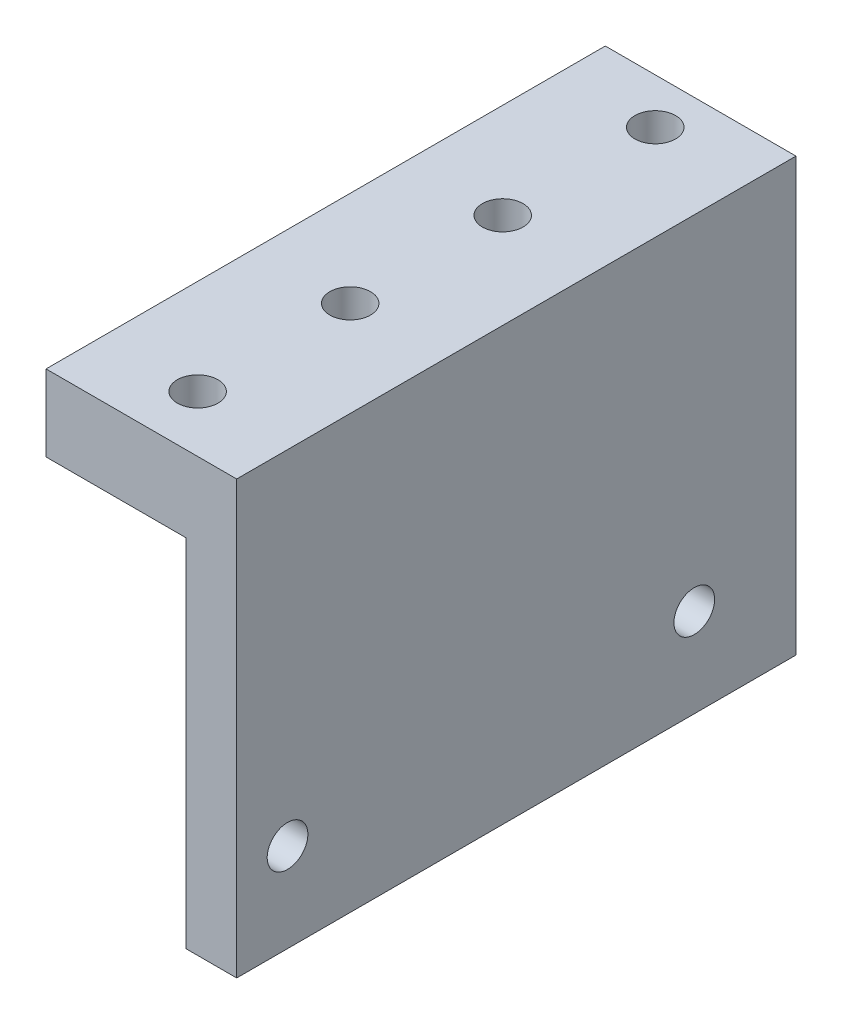
ISO-10303-21;
HEADER;
FILE_DESCRIPTION(('STEP AP214'),'2;1');
FILE_NAME('part.step','',(''),(''),'','','');
FILE_SCHEMA(('AUTOMOTIVE_DESIGN { 1 0 10303 214 1 1 1 1 }'));
ENDSEC;
DATA;
#1=APPLICATION_CONTEXT('core data for automotive mechanical design processes');
#2=APPLICATION_PROTOCOL_DEFINITION('international standard','automotive_design',2000,#1);
#3=PRODUCT_CONTEXT('',#1,'mechanical');
#4=PRODUCT('Part','Part','',(#3));
#5=PRODUCT_RELATED_PRODUCT_CATEGORY('part','',(#4));
#6=PRODUCT_DEFINITION_FORMATION('','',#4);
#7=PRODUCT_DEFINITION_CONTEXT('part definition',#1,'design');
#8=PRODUCT_DEFINITION('design','',#6,#7);
#9=PRODUCT_DEFINITION_SHAPE('','',#8);
#10=(LENGTH_UNIT() NAMED_UNIT(*) SI_UNIT(.MILLI.,.METRE.));
#11=(NAMED_UNIT(*) PLANE_ANGLE_UNIT() SI_UNIT($,.RADIAN.));
#12=(NAMED_UNIT(*) SI_UNIT($,.STERADIAN.) SOLID_ANGLE_UNIT());
#13=UNCERTAINTY_MEASURE_WITH_UNIT(LENGTH_MEASURE(1.E-05),#10,'distance_accuracy_value','');
#14=(GEOMETRIC_REPRESENTATION_CONTEXT(3) GLOBAL_UNCERTAINTY_ASSIGNED_CONTEXT((#13)) GLOBAL_UNIT_ASSIGNED_CONTEXT((#10,
#11,#12)) REPRESENTATION_CONTEXT('',''));
#15=CARTESIAN_POINT('',(0.,0.,0.));
#16=DIRECTION('',(0.,0.,1.));
#17=DIRECTION('',(1.,0.,0.));
#18=AXIS2_PLACEMENT_3D('',#15,#16,#17);
#19=CARTESIAN_POINT('',(-65.5851564185545,60.7407982740022,44.));
#20=DIRECTION('',(0.,-1.,0.));
#21=DIRECTION('',(1.,0.,0.));
#22=AXIS2_PLACEMENT_3D('',#19,#20,#21);
#23=PLANE('',#22);
#24=CARTESIAN_POINT('',(-73.0851564185545,60.7407982740022,3.57167359496557));
#25=DIRECTION('',(0.,1.,0.));
#26=DIRECTION('',(-1.,0.,0.));
#27=AXIS2_PLACEMENT_3D('',#24,#25,#26);
#28=CIRCLE('',#27,1.60000000000001);
#29=CARTESIAN_POINT('',(-74.6851564185545,60.7407982740022,3.57167359496557));
#30=VERTEX_POINT('',#29);
#31=EDGE_CURVE('E144',#30,#30,#28,.T.);
#32=ORIENTED_EDGE('',*,*,#31,.F.);
#33=EDGE_LOOP('',(#32));
#34=FACE_BOUND('',#33,.T.);
#35=CARTESIAN_POINT('',(-73.0851564185542,60.7407982740022,15.5716735949656));
#36=DIRECTION('',(0.,1.,0.));
#37=DIRECTION('',(-1.,0.,0.));
#38=AXIS2_PLACEMENT_3D('',#35,#36,#37);
#39=CIRCLE('',#38,1.60000000000001);
#40=CARTESIAN_POINT('',(-74.6851564185542,60.7407982740022,15.5716735949656));
#41=VERTEX_POINT('',#40);
#42=EDGE_CURVE('E203',#41,#41,#39,.T.);
#43=ORIENTED_EDGE('',*,*,#42,.F.);
#44=EDGE_LOOP('',(#43));
#45=FACE_BOUND('',#44,.T.);
#46=CARTESIAN_POINT('',(-73.0851564185539,60.7407982740022,27.5716735949656));
#47=DIRECTION('',(0.,1.,0.));
#48=DIRECTION('',(-1.,0.,0.));
#49=AXIS2_PLACEMENT_3D('',#46,#47,#48);
#50=CIRCLE('',#49,1.6);
#51=CARTESIAN_POINT('',(-74.6851564185539,60.7407982740022,27.5716735949656));
#52=VERTEX_POINT('',#51);
#53=EDGE_CURVE('E207',#52,#52,#50,.T.);
#54=ORIENTED_EDGE('',*,*,#53,.F.);
#55=EDGE_LOOP('',(#54));
#56=FACE_BOUND('',#55,.T.);
#57=CARTESIAN_POINT('',(-73.0851564185536,60.7407982740022,39.5716735949656));
#58=DIRECTION('',(0.,1.,0.));
#59=DIRECTION('',(-1.,0.,0.));
#60=AXIS2_PLACEMENT_3D('',#57,#58,#59);
#61=CIRCLE('',#60,1.60000000000001);
#62=CARTESIAN_POINT('',(-74.6851564185536,60.7407982740022,39.5716735949656));
#63=VERTEX_POINT('',#62);
#64=EDGE_CURVE('E210',#63,#63,#61,.T.);
#65=ORIENTED_EDGE('',*,*,#64,.F.);
#66=EDGE_LOOP('',(#65));
#67=FACE_BOUND('',#66,.T.);
#68=DIRECTION('',(-1.,0.,0.));
#69=VECTOR('',#68,1.);
#70=CARTESIAN_POINT('',(-65.5851564185545,60.7407982740022,0.));
#71=LINE('',#70,#69);
#72=CARTESIAN_POINT('',(-65.5851564185545,60.7407982740022,0.));
#73=VERTEX_POINT('',#72);
#74=CARTESIAN_POINT('',(-80.5851564185545,60.7407982740022,0.));
#75=VERTEX_POINT('',#74);
#76=EDGE_CURVE('E123',#73,#75,#71,.T.);
#77=ORIENTED_EDGE('',*,*,#76,.T.);
#78=DIRECTION('',(0.,0.,-1.));
#79=VECTOR('',#78,1.);
#80=CARTESIAN_POINT('',(-80.5851564185545,60.7407982740022,44.));
#81=LINE('',#80,#79);
#82=CARTESIAN_POINT('',(-80.5851564185545,60.7407982740022,44.));
#83=VERTEX_POINT('',#82);
#84=EDGE_CURVE('E11',#83,#75,#81,.T.);
#85=ORIENTED_EDGE('',*,*,#84,.F.);
#86=DIRECTION('',(-1.,0.,0.));
#87=VECTOR('',#86,1.);
#88=CARTESIAN_POINT('',(-65.5851564185545,60.7407982740022,44.));
#89=LINE('',#88,#87);
#90=CARTESIAN_POINT('',(-65.5851564185545,60.7407982740022,44.));
#91=VERTEX_POINT('',#90);
#92=EDGE_CURVE('E134',#91,#83,#89,.T.);
#93=ORIENTED_EDGE('',*,*,#92,.F.);
#94=DIRECTION('',(0.,0.,-1.));
#95=VECTOR('',#94,1.);
#96=CARTESIAN_POINT('',(-65.5851564185545,60.7407982740022,44.));
#97=LINE('',#96,#95);
#98=EDGE_CURVE('E119',#91,#73,#97,.T.);
#99=ORIENTED_EDGE('',*,*,#98,.T.);
#100=EDGE_LOOP('',(#77,#85,#93,#99));
#101=FACE_BOUND('',#100,.T.);
#102=ADVANCED_FACE('F37',(#34,#45,#56,#67,#101),#23,.F.);
#103=CARTESIAN_POINT('',(-80.5851564185545,60.7407982740022,44.));
#104=DIRECTION('',(1.,0.,0.));
#105=DIRECTION('',(0.,1.,0.));
#106=AXIS2_PLACEMENT_3D('',#103,#104,#105);
#107=PLANE('',#106);
#108=DIRECTION('',(0.,-1.,0.));
#109=VECTOR('',#108,1.);
#110=CARTESIAN_POINT('',(-80.5851564185545,60.7407982740022,0.));
#111=LINE('',#110,#109);
#112=CARTESIAN_POINT('',(-80.5851564185545,54.7407982740022,0.));
#113=VERTEX_POINT('',#112);
#114=EDGE_CURVE('E126',#75,#113,#111,.T.);
#115=ORIENTED_EDGE('',*,*,#114,.T.);
#116=DIRECTION('',(0.,0.,-1.));
#117=VECTOR('',#116,1.);
#118=CARTESIAN_POINT('',(-80.5851564185545,54.7407982740022,44.));
#119=LINE('',#118,#117);
#120=CARTESIAN_POINT('',(-80.5851564185545,54.7407982740022,44.));
#121=VERTEX_POINT('',#120);
#122=EDGE_CURVE('E46',#121,#113,#119,.T.);
#123=ORIENTED_EDGE('',*,*,#122,.F.);
#124=DIRECTION('',(0.,-1.,0.));
#125=VECTOR('',#124,1.);
#126=CARTESIAN_POINT('',(-80.5851564185545,60.7407982740022,44.));
#127=LINE('',#126,#125);
#128=EDGE_CURVE('E92',#83,#121,#127,.T.);
#129=ORIENTED_EDGE('',*,*,#128,.F.);
#130=ORIENTED_EDGE('',*,*,#84,.T.);
#131=EDGE_LOOP('',(#115,#123,#129,#130));
#132=FACE_BOUND('',#131,.T.);
#133=ADVANCED_FACE('F171',(#132),#107,.F.);
#134=CARTESIAN_POINT('',(-80.5851564185545,54.7407982740022,44.));
#135=DIRECTION('',(0.,1.,0.));
#136=DIRECTION('',(0.,0.,1.));
#137=AXIS2_PLACEMENT_3D('',#134,#135,#136);
#138=PLANE('',#137);
#139=CARTESIAN_POINT('',(-73.0851564185545,54.7407982740022,3.57167359496557));
#140=DIRECTION('',(0.,1.,0.));
#141=DIRECTION('',(0.,0.,1.));
#142=AXIS2_PLACEMENT_3D('',#139,#140,#141);
#143=CIRCLE('',#142,1.60000000000001);
#144=CARTESIAN_POINT('',(-73.0851564185545,54.7407982740022,5.17167359496558));
#145=VERTEX_POINT('',#144);
#146=EDGE_CURVE('E40',#145,#145,#143,.T.);
#147=ORIENTED_EDGE('',*,*,#146,.T.);
#148=EDGE_LOOP('',(#147));
#149=FACE_BOUND('',#148,.T.);
#150=CARTESIAN_POINT('',(-73.0851564185542,54.7407982740022,15.5716735949656));
#151=DIRECTION('',(0.,1.,0.));
#152=DIRECTION('',(0.,0.,1.));
#153=AXIS2_PLACEMENT_3D('',#150,#151,#152);
#154=CIRCLE('',#153,1.60000000000001);
#155=CARTESIAN_POINT('',(-73.0851564185542,54.7407982740022,17.1716735949656));
#156=VERTEX_POINT('',#155);
#157=EDGE_CURVE('E146',#156,#156,#154,.T.);
#158=ORIENTED_EDGE('',*,*,#157,.T.);
#159=EDGE_LOOP('',(#158));
#160=FACE_BOUND('',#159,.T.);
#161=CARTESIAN_POINT('',(-73.0851564185539,54.7407982740022,27.5716735949656));
#162=DIRECTION('',(0.,1.,0.));
#163=DIRECTION('',(0.,0.,1.));
#164=AXIS2_PLACEMENT_3D('',#161,#162,#163);
#165=CIRCLE('',#164,1.6);
#166=CARTESIAN_POINT('',(-73.0851564185539,54.7407982740022,29.1716735949656));
#167=VERTEX_POINT('',#166);
#168=EDGE_CURVE('E143',#167,#167,#165,.T.);
#169=ORIENTED_EDGE('',*,*,#168,.T.);
#170=EDGE_LOOP('',(#169));
#171=FACE_BOUND('',#170,.T.);
#172=CARTESIAN_POINT('',(-73.0851564185536,54.7407982740022,39.5716735949656));
#173=DIRECTION('',(0.,1.,0.));
#174=DIRECTION('',(0.,0.,1.));
#175=AXIS2_PLACEMENT_3D('',#172,#173,#174);
#176=CIRCLE('',#175,1.60000000000001);
#177=CARTESIAN_POINT('',(-73.0851564185536,54.7407982740022,41.1716735949656));
#178=VERTEX_POINT('',#177);
#179=EDGE_CURVE('E140',#178,#178,#176,.T.);
#180=ORIENTED_EDGE('',*,*,#179,.T.);
#181=EDGE_LOOP('',(#180));
#182=FACE_BOUND('',#181,.T.);
#183=DIRECTION('',(1.,0.,0.));
#184=VECTOR('',#183,1.);
#185=CARTESIAN_POINT('',(-80.5851564185545,54.7407982740022,0.));
#186=LINE('',#185,#184);
#187=CARTESIAN_POINT('',(-69.5851564185545,54.7407982740022,0.));
#188=VERTEX_POINT('',#187);
#189=EDGE_CURVE('E129',#113,#188,#186,.T.);
#190=ORIENTED_EDGE('',*,*,#189,.T.);
#191=DIRECTION('',(0.,0.,-1.));
#192=VECTOR('',#191,1.);
#193=CARTESIAN_POINT('',(-69.5851564185545,54.7407982740022,44.));
#194=LINE('',#193,#192);
#195=CARTESIAN_POINT('',(-69.5851564185545,54.7407982740022,44.));
#196=VERTEX_POINT('',#195);
#197=EDGE_CURVE('E114',#196,#188,#194,.T.);
#198=ORIENTED_EDGE('',*,*,#197,.F.);
#199=DIRECTION('',(1.,0.,0.));
#200=VECTOR('',#199,1.);
#201=CARTESIAN_POINT('',(-80.5851564185545,54.7407982740022,44.));
#202=LINE('',#201,#200);
#203=EDGE_CURVE('E105',#121,#196,#202,.T.);
#204=ORIENTED_EDGE('',*,*,#203,.F.);
#205=ORIENTED_EDGE('',*,*,#122,.T.);
#206=EDGE_LOOP('',(#190,#198,#204,#205));
#207=FACE_BOUND('',#206,.T.);
#208=ADVANCED_FACE('F174',(#149,#160,#171,#182,#207),#138,.F.);
#209=CARTESIAN_POINT('',(-69.5851564185545,54.7407982740022,44.));
#210=DIRECTION('',(1.,0.,0.));
#211=DIRECTION('',(0.,0.,-1.));
#212=AXIS2_PLACEMENT_3D('',#209,#210,#211);
#213=PLANE('',#212);
#214=CARTESIAN_POINT('',(-69.5851564185545,33.7407982740022,40.));
#215=DIRECTION('',(1.,0.,0.));
#216=DIRECTION('',(0.,0.,-1.));
#217=AXIS2_PLACEMENT_3D('',#214,#215,#216);
#218=CIRCLE('',#217,1.6);
#219=CARTESIAN_POINT('',(-69.5851564185545,33.7407982740022,38.4));
#220=VERTEX_POINT('',#219);
#221=EDGE_CURVE('E127',#220,#220,#218,.T.);
#222=ORIENTED_EDGE('',*,*,#221,.T.);
#223=EDGE_LOOP('',(#222));
#224=FACE_BOUND('',#223,.T.);
#225=CARTESIAN_POINT('',(-69.5851564185545,33.7407982740022,7.99999999999999));
#226=DIRECTION('',(1.,0.,0.));
#227=DIRECTION('',(0.,0.,-1.));
#228=AXIS2_PLACEMENT_3D('',#225,#226,#227);
#229=CIRCLE('',#228,1.6);
#230=CARTESIAN_POINT('',(-69.5851564185545,33.7407982740022,6.4));
#231=VERTEX_POINT('',#230);
#232=EDGE_CURVE('E160',#231,#231,#229,.T.);
#233=ORIENTED_EDGE('',*,*,#232,.T.);
#234=EDGE_LOOP('',(#233));
#235=FACE_BOUND('',#234,.T.);
#236=DIRECTION('',(0.,-1.,0.));
#237=VECTOR('',#236,1.);
#238=CARTESIAN_POINT('',(-69.5851564185545,54.7407982740022,0.));
#239=LINE('',#238,#237);
#240=CARTESIAN_POINT('',(-69.5851564185545,26.7407982740022,0.));
#241=VERTEX_POINT('',#240);
#242=EDGE_CURVE('E113',#188,#241,#239,.T.);
#243=ORIENTED_EDGE('',*,*,#242,.T.);
#244=DIRECTION('',(0.,0.,-1.));
#245=VECTOR('',#244,1.);
#246=CARTESIAN_POINT('',(-69.5851564185545,26.7407982740022,44.));
#247=LINE('',#246,#245);
#248=CARTESIAN_POINT('',(-69.5851564185545,26.7407982740022,44.));
#249=VERTEX_POINT('',#248);
#250=EDGE_CURVE('E110',#249,#241,#247,.T.);
#251=ORIENTED_EDGE('',*,*,#250,.F.);
#252=DIRECTION('',(0.,-1.,0.));
#253=VECTOR('',#252,1.);
#254=CARTESIAN_POINT('',(-69.5851564185545,54.7407982740022,44.));
#255=LINE('',#254,#253);
#256=EDGE_CURVE('E99',#196,#249,#255,.T.);
#257=ORIENTED_EDGE('',*,*,#256,.F.);
#258=ORIENTED_EDGE('',*,*,#197,.T.);
#259=EDGE_LOOP('',(#243,#251,#257,#258));
#260=FACE_BOUND('',#259,.T.);
#261=ADVANCED_FACE('F111',(#224,#235,#260),#213,.F.);
#262=CARTESIAN_POINT('',(-65.5851564185545,26.7407982740022,44.));
#263=DIRECTION('',(0.,1.,0.));
#264=DIRECTION('',(0.,0.,1.));
#265=AXIS2_PLACEMENT_3D('',#262,#263,#264);
#266=PLANE('',#265);
#267=DIRECTION('',(1.,0.,0.));
#268=VECTOR('',#267,1.);
#269=CARTESIAN_POINT('',(-65.5851564185545,26.7407982740022,0.));
#270=LINE('',#269,#268);
#271=CARTESIAN_POINT('',(-65.5851564185545,26.7407982740022,0.));
#272=VERTEX_POINT('',#271);
#273=EDGE_CURVE('E78',#241,#272,#270,.T.);
#274=ORIENTED_EDGE('',*,*,#273,.T.);
#275=DIRECTION('',(0.,0.,-1.));
#276=VECTOR('',#275,1.);
#277=CARTESIAN_POINT('',(-65.5851564185545,26.7407982740022,44.));
#278=LINE('',#277,#276);
#279=CARTESIAN_POINT('',(-65.5851564185545,26.7407982740022,44.));
#280=VERTEX_POINT('',#279);
#281=EDGE_CURVE('E115',#280,#272,#278,.T.);
#282=ORIENTED_EDGE('',*,*,#281,.F.);
#283=DIRECTION('',(1.,0.,0.));
#284=VECTOR('',#283,1.);
#285=CARTESIAN_POINT('',(-65.5851564185545,26.7407982740022,44.));
#286=LINE('',#285,#284);
#287=EDGE_CURVE('E103',#249,#280,#286,.T.);
#288=ORIENTED_EDGE('',*,*,#287,.F.);
#289=ORIENTED_EDGE('',*,*,#250,.T.);
#290=EDGE_LOOP('',(#274,#282,#288,#289));
#291=FACE_BOUND('',#290,.T.);
#292=ADVANCED_FACE('F117',(#291),#266,.F.);
#293=CARTESIAN_POINT('',(-65.5851564185545,26.7407982740022,44.));
#294=DIRECTION('',(-1.,0.,0.));
#295=DIRECTION('',(0.,0.,1.));
#296=AXIS2_PLACEMENT_3D('',#293,#294,#295);
#297=PLANE('',#296);
#298=CARTESIAN_POINT('',(-65.5851564185545,33.7407982740022,40.));
#299=DIRECTION('',(1.,0.,0.));
#300=DIRECTION('',(0.,0.,-1.));
#301=AXIS2_PLACEMENT_3D('',#298,#299,#300);
#302=CIRCLE('',#301,1.6);
#303=CARTESIAN_POINT('',(-65.5851564185545,33.7407982740022,38.4));
#304=VERTEX_POINT('',#303);
#305=EDGE_CURVE('E155',#304,#304,#302,.T.);
#306=ORIENTED_EDGE('',*,*,#305,.F.);
#307=EDGE_LOOP('',(#306));
#308=FACE_BOUND('',#307,.T.);
#309=CARTESIAN_POINT('',(-65.5851564185545,33.7407982740022,7.99999999999999));
#310=DIRECTION('',(1.,0.,0.));
#311=DIRECTION('',(0.,0.,-1.));
#312=AXIS2_PLACEMENT_3D('',#309,#310,#311);
#313=CIRCLE('',#312,1.6);
#314=CARTESIAN_POINT('',(-65.5851564185545,33.7407982740022,6.4));
#315=VERTEX_POINT('',#314);
#316=EDGE_CURVE('E151',#315,#315,#313,.T.);
#317=ORIENTED_EDGE('',*,*,#316,.F.);
#318=EDGE_LOOP('',(#317));
#319=FACE_BOUND('',#318,.T.);
#320=DIRECTION('',(0.,1.,0.));
#321=VECTOR('',#320,1.);
#322=CARTESIAN_POINT('',(-65.5851564185545,26.7407982740022,0.));
#323=LINE('',#322,#321);
#324=EDGE_CURVE('E84',#272,#73,#323,.T.);
#325=ORIENTED_EDGE('',*,*,#324,.T.);
#326=ORIENTED_EDGE('',*,*,#98,.F.);
#327=DIRECTION('',(0.,1.,0.));
#328=VECTOR('',#327,1.);
#329=CARTESIAN_POINT('',(-65.5851564185545,26.7407982740022,44.));
#330=LINE('',#329,#328);
#331=EDGE_CURVE('E55',#280,#91,#330,.T.);
#332=ORIENTED_EDGE('',*,*,#331,.F.);
#333=ORIENTED_EDGE('',*,*,#281,.T.);
#334=EDGE_LOOP('',(#325,#326,#332,#333));
#335=FACE_BOUND('',#334,.T.);
#336=ADVANCED_FACE('F179',(#308,#319,#335),#297,.F.);
#337=CARTESIAN_POINT('',(0.,0.,44.));
#338=DIRECTION('',(0.,0.,1.));
#339=DIRECTION('',(1.,0.,0.));
#340=AXIS2_PLACEMENT_3D('',#337,#338,#339);
#341=PLANE('',#340);
#342=ORIENTED_EDGE('',*,*,#92,.T.);
#343=ORIENTED_EDGE('',*,*,#128,.T.);
#344=ORIENTED_EDGE('',*,*,#203,.T.);
#345=ORIENTED_EDGE('',*,*,#256,.T.);
#346=ORIENTED_EDGE('',*,*,#287,.T.);
#347=ORIENTED_EDGE('',*,*,#331,.T.);
#348=EDGE_LOOP('',(#342,#343,#344,#345,#346,#347));
#349=FACE_BOUND('',#348,.T.);
#350=ADVANCED_FACE('F101',(#349),#341,.T.);
#351=CARTESIAN_POINT('',(0.,0.,0.));
#352=DIRECTION('',(0.,0.,1.));
#353=DIRECTION('',(1.,0.,0.));
#354=AXIS2_PLACEMENT_3D('',#351,#352,#353);
#355=PLANE('',#354);
#356=ORIENTED_EDGE('',*,*,#76,.F.);
#357=ORIENTED_EDGE('',*,*,#324,.F.);
#358=ORIENTED_EDGE('',*,*,#273,.F.);
#359=ORIENTED_EDGE('',*,*,#242,.F.);
#360=ORIENTED_EDGE('',*,*,#189,.F.);
#361=ORIENTED_EDGE('',*,*,#114,.F.);
#362=EDGE_LOOP('',(#356,#357,#358,#359,#360,#361));
#363=FACE_BOUND('',#362,.T.);
#364=ADVANCED_FACE('F177',(#363),#355,.F.);
#365=CARTESIAN_POINT('',(-75.5851564185545,33.7407982740022,7.99999999999999));
#366=DIRECTION('',(1.,0.,0.));
#367=DIRECTION('',(0.,0.,-1.));
#368=AXIS2_PLACEMENT_3D('',#365,#366,#367);
#369=CYLINDRICAL_SURFACE('',#368,1.6);
#370=ORIENTED_EDGE('',*,*,#316,.T.);
#371=EDGE_LOOP('',(#370));
#372=FACE_BOUND('',#371,.T.);
#373=ORIENTED_EDGE('',*,*,#232,.F.);
#374=EDGE_LOOP('',(#373));
#375=FACE_BOUND('',#374,.T.);
#376=ADVANCED_FACE('F237',(#372,#375),#369,.F.);
#377=CARTESIAN_POINT('',(-75.5851564185545,33.7407982740022,40.));
#378=DIRECTION('',(1.,0.,0.));
#379=DIRECTION('',(0.,0.,-1.));
#380=AXIS2_PLACEMENT_3D('',#377,#378,#379);
#381=CYLINDRICAL_SURFACE('',#380,1.6);
#382=ORIENTED_EDGE('',*,*,#305,.T.);
#383=EDGE_LOOP('',(#382));
#384=FACE_BOUND('',#383,.T.);
#385=ORIENTED_EDGE('',*,*,#221,.F.);
#386=EDGE_LOOP('',(#385));
#387=FACE_BOUND('',#386,.T.);
#388=ADVANCED_FACE('F234',(#384,#387),#381,.F.);
#389=CARTESIAN_POINT('',(-73.0851564185536,50.7407982740022,39.5716735949656));
#390=DIRECTION('',(0.,1.,0.));
#391=DIRECTION('',(-1.,0.,0.));
#392=AXIS2_PLACEMENT_3D('',#389,#390,#391);
#393=CYLINDRICAL_SURFACE('',#392,1.60000000000001);
#394=ORIENTED_EDGE('',*,*,#64,.T.);
#395=EDGE_LOOP('',(#394));
#396=FACE_BOUND('',#395,.T.);
#397=ORIENTED_EDGE('',*,*,#179,.F.);
#398=EDGE_LOOP('',(#397));
#399=FACE_BOUND('',#398,.T.);
#400=ADVANCED_FACE('F230',(#396,#399),#393,.F.);
#401=CARTESIAN_POINT('',(-73.0851564185539,50.7407982740022,27.5716735949656));
#402=DIRECTION('',(0.,1.,0.));
#403=DIRECTION('',(-1.,0.,0.));
#404=AXIS2_PLACEMENT_3D('',#401,#402,#403);
#405=CYLINDRICAL_SURFACE('',#404,1.6);
#406=ORIENTED_EDGE('',*,*,#53,.T.);
#407=EDGE_LOOP('',(#406));
#408=FACE_BOUND('',#407,.T.);
#409=ORIENTED_EDGE('',*,*,#168,.F.);
#410=EDGE_LOOP('',(#409));
#411=FACE_BOUND('',#410,.T.);
#412=ADVANCED_FACE('F224',(#408,#411),#405,.F.);
#413=CARTESIAN_POINT('',(-73.0851564185542,50.7407982740022,15.5716735949656));
#414=DIRECTION('',(0.,1.,0.));
#415=DIRECTION('',(-1.,0.,0.));
#416=AXIS2_PLACEMENT_3D('',#413,#414,#415);
#417=CYLINDRICAL_SURFACE('',#416,1.60000000000001);
#418=ORIENTED_EDGE('',*,*,#42,.T.);
#419=EDGE_LOOP('',(#418));
#420=FACE_BOUND('',#419,.T.);
#421=ORIENTED_EDGE('',*,*,#157,.F.);
#422=EDGE_LOOP('',(#421));
#423=FACE_BOUND('',#422,.T.);
#424=ADVANCED_FACE('F219',(#420,#423),#417,.F.);
#425=CARTESIAN_POINT('',(-73.0851564185545,50.7407982740022,3.57167359496557));
#426=DIRECTION('',(0.,1.,0.));
#427=DIRECTION('',(-1.,0.,0.));
#428=AXIS2_PLACEMENT_3D('',#425,#426,#427);
#429=CYLINDRICAL_SURFACE('',#428,1.60000000000001);
#430=ORIENTED_EDGE('',*,*,#31,.T.);
#431=EDGE_LOOP('',(#430));
#432=FACE_BOUND('',#431,.T.);
#433=ORIENTED_EDGE('',*,*,#146,.F.);
#434=EDGE_LOOP('',(#433));
#435=FACE_BOUND('',#434,.T.);
#436=ADVANCED_FACE('F216',(#432,#435),#429,.F.);
#437=CLOSED_SHELL('',(#102,#133,#208,#261,#292,#336,#350,#364,#376,#388,#400,#412,#424,#436));
#438=MANIFOLD_SOLID_BREP('B2',#437);
#439=ADVANCED_BREP_SHAPE_REPRESENTATION('',(#18,#438),#14);
#440=SHAPE_DEFINITION_REPRESENTATION(#9,#439);
ENDSEC;
END-ISO-10303-21;
